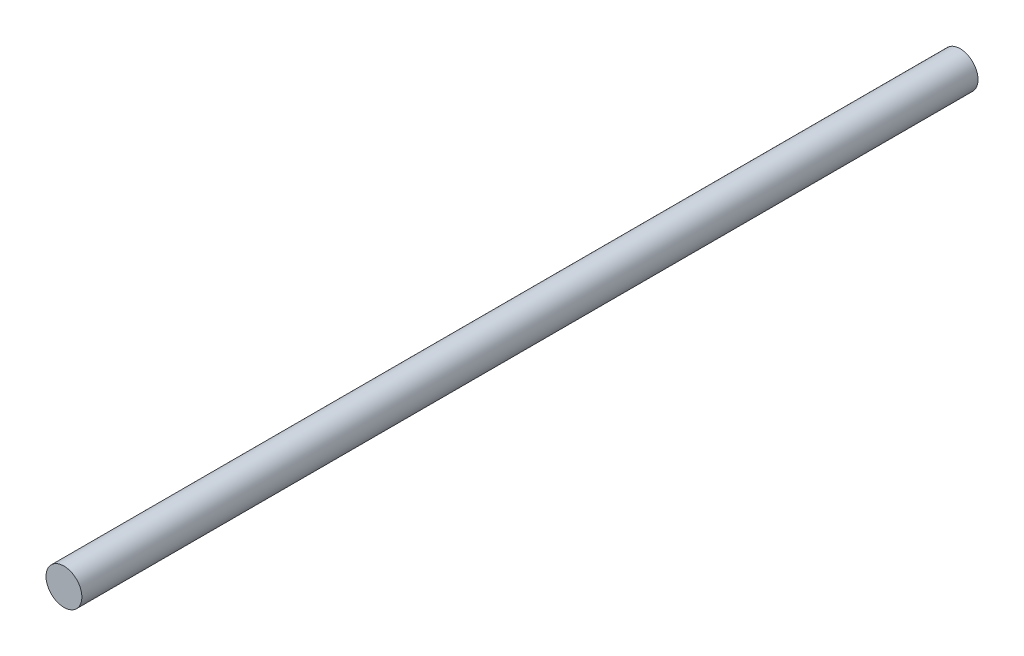
ISO-10303-21;
HEADER;
FILE_DESCRIPTION(('STEP AP214'),'2;1');
FILE_NAME('part.step','',(''),(''),'','','');
FILE_SCHEMA(('AUTOMOTIVE_DESIGN { 1 0 10303 214 1 1 1 1 }'));
ENDSEC;
DATA;
#1=APPLICATION_CONTEXT('core data for automotive mechanical design processes');
#2=APPLICATION_PROTOCOL_DEFINITION('international standard','automotive_design',2000,#1);
#3=PRODUCT_CONTEXT('',#1,'mechanical');
#4=PRODUCT('Part','Part','',(#3));
#5=PRODUCT_RELATED_PRODUCT_CATEGORY('part','',(#4));
#6=PRODUCT_DEFINITION_FORMATION('','',#4);
#7=PRODUCT_DEFINITION_CONTEXT('part definition',#1,'design');
#8=PRODUCT_DEFINITION('design','',#6,#7);
#9=PRODUCT_DEFINITION_SHAPE('','',#8);
#10=(LENGTH_UNIT() NAMED_UNIT(*) SI_UNIT(.MILLI.,.METRE.));
#11=(NAMED_UNIT(*) PLANE_ANGLE_UNIT() SI_UNIT($,.RADIAN.));
#12=(NAMED_UNIT(*) SI_UNIT($,.STERADIAN.) SOLID_ANGLE_UNIT());
#13=UNCERTAINTY_MEASURE_WITH_UNIT(LENGTH_MEASURE(1.E-05),#10,'distance_accuracy_value','');
#14=(GEOMETRIC_REPRESENTATION_CONTEXT(3) GLOBAL_UNCERTAINTY_ASSIGNED_CONTEXT((#13)) GLOBAL_UNIT_ASSIGNED_CONTEXT((#10,
#11,#12)) REPRESENTATION_CONTEXT('',''));
#15=CARTESIAN_POINT('',(0.,0.,0.));
#16=DIRECTION('',(0.,0.,1.));
#17=DIRECTION('',(1.,0.,0.));
#18=AXIS2_PLACEMENT_3D('',#15,#16,#17);
#19=CARTESIAN_POINT('',(0.,0.,500.));
#20=DIRECTION('',(0.,0.,-0.999999999999999));
#21=DIRECTION('',(-1.,0.,0.));
#22=AXIS2_PLACEMENT_3D('',#19,#20,#21);
#23=CYLINDRICAL_SURFACE('',#22,10.);
#24=CARTESIAN_POINT('',(0.,0.,500.));
#25=DIRECTION('',(0.,0.,0.999999999999999));
#26=DIRECTION('',(1.,0.,0.));
#27=AXIS2_PLACEMENT_3D('',#24,#25,#26);
#28=CIRCLE('',#27,10.);
#29=CARTESIAN_POINT('',(-10.,0.,500.));
#30=VERTEX_POINT('',#29);
#31=EDGE_CURVE('E10',#30,#30,#28,.T.);
#32=CARTESIAN_POINT('',(0.,0.,0.));
#33=DIRECTION('',(0.,0.,0.999999999999999));
#34=DIRECTION('',(1.,0.,0.));
#35=AXIS2_PLACEMENT_3D('',#32,#33,#34);
#36=CIRCLE('',#35,10.);
#37=CARTESIAN_POINT('',(-10.,0.,0.));
#38=VERTEX_POINT('',#37);
#39=EDGE_CURVE('E31',#38,#38,#36,.T.);
#40=CARTESIAN_POINT('',(-10.,0.,500.));
#41=CARTESIAN_POINT('',(-10.,0.,494.791666666666));
#42=CARTESIAN_POINT('',(-10.,0.,489.583333333333));
#43=CARTESIAN_POINT('',(-10.,0.,479.166666666666));
#44=CARTESIAN_POINT('',(-10.,0.,473.958333333333));
#45=CARTESIAN_POINT('',(-10.,0.,463.541666666666));
#46=CARTESIAN_POINT('',(-10.,0.,458.333333333333));
#47=CARTESIAN_POINT('',(-10.,0.,447.916666666666));
#48=CARTESIAN_POINT('',(-10.,0.,442.708333333333));
#49=CARTESIAN_POINT('',(-10.,0.,432.291666666666));
#50=CARTESIAN_POINT('',(-10.,0.,427.083333333333));
#51=CARTESIAN_POINT('',(-10.,0.,416.666666666666));
#52=CARTESIAN_POINT('',(-10.,0.,411.458333333333));
#53=CARTESIAN_POINT('',(-10.,0.,401.041666666666));
#54=CARTESIAN_POINT('',(-10.,0.,395.833333333333));
#55=CARTESIAN_POINT('',(-10.,0.,385.416666666666));
#56=CARTESIAN_POINT('',(-10.,0.,380.208333333333));
#57=CARTESIAN_POINT('',(-10.,0.,369.791666666666));
#58=CARTESIAN_POINT('',(-10.,0.,364.583333333333));
#59=CARTESIAN_POINT('',(-10.,0.,354.166666666666));
#60=CARTESIAN_POINT('',(-10.,0.,348.958333333333));
#61=CARTESIAN_POINT('',(-10.,0.,338.541666666666));
#62=CARTESIAN_POINT('',(-10.,0.,333.333333333333));
#63=CARTESIAN_POINT('',(-10.,0.,322.916666666666));
#64=CARTESIAN_POINT('',(-10.,0.,317.708333333333));
#65=CARTESIAN_POINT('',(-10.,0.,307.291666666666));
#66=CARTESIAN_POINT('',(-10.,0.,302.083333333333));
#67=CARTESIAN_POINT('',(-10.,0.,291.666666666666));
#68=CARTESIAN_POINT('',(-10.,0.,286.458333333333));
#69=CARTESIAN_POINT('',(-10.,0.,276.041666666666));
#70=CARTESIAN_POINT('',(-10.,0.,270.833333333333));
#71=CARTESIAN_POINT('',(-10.,0.,260.416666666667));
#72=CARTESIAN_POINT('',(-10.,0.,255.208333333333));
#73=CARTESIAN_POINT('',(-10.,0.,244.791666666666));
#74=CARTESIAN_POINT('',(-10.,0.,239.583333333333));
#75=CARTESIAN_POINT('',(-10.,0.,229.166666666666));
#76=CARTESIAN_POINT('',(-10.,0.,223.958333333333));
#77=CARTESIAN_POINT('',(-10.,0.,213.541666666667));
#78=CARTESIAN_POINT('',(-10.,0.,208.333333333333));
#79=CARTESIAN_POINT('',(-10.,0.,197.916666666667));
#80=CARTESIAN_POINT('',(-10.,0.,192.708333333333));
#81=CARTESIAN_POINT('',(-10.,0.,182.291666666667));
#82=CARTESIAN_POINT('',(-10.,0.,177.083333333333));
#83=CARTESIAN_POINT('',(-10.,0.,166.666666666667));
#84=CARTESIAN_POINT('',(-10.,0.,161.458333333333));
#85=CARTESIAN_POINT('',(-10.,0.,151.041666666667));
#86=CARTESIAN_POINT('',(-10.,0.,145.833333333333));
#87=CARTESIAN_POINT('',(-10.,0.,135.416666666667));
#88=CARTESIAN_POINT('',(-10.,0.,130.208333333333));
#89=CARTESIAN_POINT('',(-10.,0.,119.791666666667));
#90=CARTESIAN_POINT('',(-10.,0.,114.583333333333));
#91=CARTESIAN_POINT('',(-10.,0.,104.166666666667));
#92=CARTESIAN_POINT('',(-10.,0.,98.9583333333333));
#93=CARTESIAN_POINT('',(-10.,0.,88.5416666666666));
#94=CARTESIAN_POINT('',(-10.,0.,83.3333333333333));
#95=CARTESIAN_POINT('',(-10.,0.,72.9166666666666));
#96=CARTESIAN_POINT('',(-10.,0.,67.7083333333333));
#97=CARTESIAN_POINT('',(-10.,0.,57.2916666666666));
#98=CARTESIAN_POINT('',(-10.,0.,52.0833333333333));
#99=CARTESIAN_POINT('',(-10.,0.,41.6666666666666));
#100=CARTESIAN_POINT('',(-10.,0.,36.4583333333333));
#101=CARTESIAN_POINT('',(-10.,0.,26.0416666666667));
#102=CARTESIAN_POINT('',(-10.,0.,20.8333333333333));
#103=CARTESIAN_POINT('',(-10.,0.,10.4166666666667));
#104=CARTESIAN_POINT('',(-10.,0.,5.20833333333333));
#105=CARTESIAN_POINT('',(-10.,0.,0.));
#106=B_SPLINE_CURVE_WITH_KNOTS('',3,(#40,#41,#42,#43,#44,#45,#46,#47,#48,#49,#50,#51,#52,#53,
#54,#55,#56,#57,#58,#59,#60,#61,#62,#63,#64,#65,#66,#67,#68,#69,#70,#71,#72,#73,#74,#75,#76,#77,
#78,#79,#80,#81,#82,#83,#84,#85,#86,#87,#88,#89,#90,#91,#92,#93,#94,#95,#96,#97,#98,#99,#100,
#101,#102,#103,#104,#105),.UNSPECIFIED.,.F.,.F.,(4,2,2,2,2,2,2,2,2,2,2,2,2,2,2,2,2,2,2,2,2,2,2,
2,2,2,2,2,2,2,2,2,4),(0.,15.6249999999999,31.2499999999999,46.8749999999999,62.4999999999999,
78.1249999999999,93.7499999999999,109.375,125.,140.625,156.25,171.875,187.5,203.125,218.75,
234.375,250.,265.625,281.25,296.875,312.5,328.125,343.75,359.375,375.,390.625,406.25,421.875,
437.5,453.125,468.75,484.375,500.),.UNSPECIFIED.);
#107=EDGE_CURVE('BSEAM28',#30,#38,#106,.T.);
#108=ORIENTED_EDGE('',*,*,#31,.F.);
#109=ORIENTED_EDGE('',*,*,#39,.T.);
#110=ORIENTED_EDGE('',*,*,#107,.T.);
#111=ORIENTED_EDGE('',*,*,#107,.F.);
#112=EDGE_LOOP('',(#108,#110,#109,#111));
#113=FACE_BOUND('',#112,.T.);
#114=ADVANCED_FACE('F28',(#113),#23,.T.);
#115=CARTESIAN_POINT('',(0.,0.,500.));
#116=DIRECTION('',(0.,0.,0.999999999999999));
#117=DIRECTION('',(1.,0.,0.));
#118=AXIS2_PLACEMENT_3D('',#115,#116,#117);
#119=PLANE('',#118);
#120=ORIENTED_EDGE('',*,*,#31,.T.);
#121=EDGE_LOOP('',(#120));
#122=FACE_BOUND('',#121,.T.);
#123=ADVANCED_FACE('F43',(#122),#119,.T.);
#124=CARTESIAN_POINT('',(0.,0.,0.));
#125=DIRECTION('',(0.,0.,0.999999999999999));
#126=DIRECTION('',(1.,0.,0.));
#127=AXIS2_PLACEMENT_3D('',#124,#125,#126);
#128=PLANE('',#127);
#129=ORIENTED_EDGE('',*,*,#39,.F.);
#130=EDGE_LOOP('',(#129));
#131=FACE_BOUND('',#130,.T.);
#132=ADVANCED_FACE('F41',(#131),#128,.F.);
#133=CLOSED_SHELL('',(#114,#123,#132));
#134=MANIFOLD_SOLID_BREP('B2',#133);
#135=ADVANCED_BREP_SHAPE_REPRESENTATION('',(#18,#134),#14);
#136=SHAPE_DEFINITION_REPRESENTATION(#9,#135);
ENDSEC;
END-ISO-10303-21;
